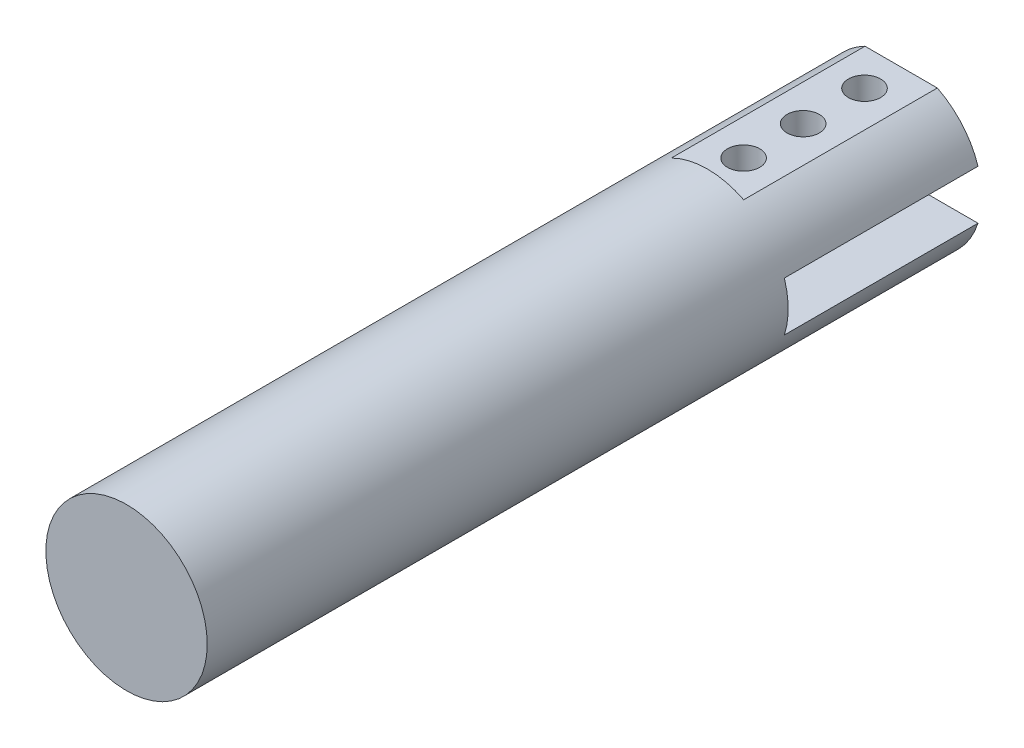
ISO-10303-21;
HEADER;
FILE_DESCRIPTION(('STEP AP214'),'2;1');
FILE_NAME('part.step','',(''),(''),'','','');
FILE_SCHEMA(('AUTOMOTIVE_DESIGN { 1 0 10303 214 1 1 1 1 }'));
ENDSEC;
DATA;
#1=APPLICATION_CONTEXT('core data for automotive mechanical design processes');
#2=APPLICATION_PROTOCOL_DEFINITION('international standard','automotive_design',2000,#1);
#3=PRODUCT_CONTEXT('',#1,'mechanical');
#4=PRODUCT('Part','Part','',(#3));
#5=PRODUCT_RELATED_PRODUCT_CATEGORY('part','',(#4));
#6=PRODUCT_DEFINITION_FORMATION('','',#4);
#7=PRODUCT_DEFINITION_CONTEXT('part definition',#1,'design');
#8=PRODUCT_DEFINITION('design','',#6,#7);
#9=PRODUCT_DEFINITION_SHAPE('','',#8);
#10=(LENGTH_UNIT() NAMED_UNIT(*) SI_UNIT(.MILLI.,.METRE.));
#11=(NAMED_UNIT(*) PLANE_ANGLE_UNIT() SI_UNIT($,.RADIAN.));
#12=(NAMED_UNIT(*) SI_UNIT($,.STERADIAN.) SOLID_ANGLE_UNIT());
#13=UNCERTAINTY_MEASURE_WITH_UNIT(LENGTH_MEASURE(1.E-05),#10,'distance_accuracy_value','');
#14=(GEOMETRIC_REPRESENTATION_CONTEXT(3) GLOBAL_UNCERTAINTY_ASSIGNED_CONTEXT((#13)) GLOBAL_UNIT_ASSIGNED_CONTEXT((#10,
#11,#12)) REPRESENTATION_CONTEXT('',''));
#15=CARTESIAN_POINT('',(0.,0.,0.));
#16=DIRECTION('',(0.,0.,1.));
#17=DIRECTION('',(1.,0.,0.));
#18=AXIS2_PLACEMENT_3D('',#15,#16,#17);
#19=CARTESIAN_POINT('',(0.,0.,0.));
#20=DIRECTION('',(0.,0.,1.));
#21=DIRECTION('',(1.,0.,0.));
#22=AXIS2_PLACEMENT_3D('',#19,#20,#21);
#23=PLANE('',#22);
#24=CARTESIAN_POINT('',(0.,0.,0.));
#25=DIRECTION('',(0.,0.,1.));
#26=DIRECTION('',(1.,0.,0.));
#27=AXIS2_PLACEMENT_3D('',#24,#25,#26);
#28=CIRCLE('',#27,12.5);
#29=CARTESIAN_POINT('',(5.60319328558987,-11.1738187297056,0.));
#30=VERTEX_POINT('',#29);
#31=CARTESIAN_POINT('',(11.901999831961,-3.82,0.));
#32=VERTEX_POINT('',#31);
#33=EDGE_CURVE('E111',#30,#32,#28,.T.);
#34=ORIENTED_EDGE('',*,*,#33,.F.);
#35=DIRECTION('',(1.,0.,0.));
#36=VECTOR('',#35,1.);
#37=CARTESIAN_POINT('',(16.1732901971352,-11.1738187297056,0.));
#38=LINE('',#37,#36);
#39=CARTESIAN_POINT('',(-5.60319328558987,-11.1738187297056,0.));
#40=VERTEX_POINT('',#39);
#41=EDGE_CURVE('E99',#40,#30,#38,.T.);
#42=ORIENTED_EDGE('',*,*,#41,.F.);
#43=CARTESIAN_POINT('',(-11.901999831961,-3.82,0.));
#44=VERTEX_POINT('',#43);
#45=EDGE_CURVE('E110',#44,#40,#28,.T.);
#46=ORIENTED_EDGE('',*,*,#45,.F.);
#47=DIRECTION('',(1.,0.,0.));
#48=VECTOR('',#47,1.);
#49=CARTESIAN_POINT('',(0.,-3.82,0.));
#50=LINE('',#49,#48);
#51=EDGE_CURVE('E131',#44,#32,#50,.T.);
#52=ORIENTED_EDGE('',*,*,#51,.T.);
#53=EDGE_LOOP('',(#34,#42,#46,#52));
#54=FACE_BOUND('',#53,.T.);
#55=ADVANCED_FACE('F31',(#54),#23,.F.);
#56=CARTESIAN_POINT('',(0.,0.,120.));
#57=DIRECTION('',(0.,0.,-1.));
#58=DIRECTION('',(-1.,0.,0.));
#59=AXIS2_PLACEMENT_3D('',#56,#57,#58);
#60=CYLINDRICAL_SURFACE('',#59,12.5);
#61=CARTESIAN_POINT('',(0.,0.,30.));
#62=DIRECTION('',(0.,0.,1.));
#63=DIRECTION('',(1.,0.,0.));
#64=AXIS2_PLACEMENT_3D('',#61,#62,#63);
#65=CIRCLE('',#64,12.5);
#66=CARTESIAN_POINT('',(-5.60319328558987,-11.1738187297056,30.));
#67=VERTEX_POINT('',#66);
#68=CARTESIAN_POINT('',(5.60319328558987,-11.1738187297056,30.));
#69=VERTEX_POINT('',#68);
#70=EDGE_CURVE('E11',#67,#69,#65,.T.);
#71=ORIENTED_EDGE('',*,*,#70,.T.);
#72=DIRECTION('',(0.,0.,-1.));
#73=VECTOR('',#72,1.);
#74=CARTESIAN_POINT('',(5.60319328558987,-11.1738187297056,120.));
#75=LINE('',#74,#73);
#76=EDGE_CURVE('E103',#69,#30,#75,.T.);
#77=ORIENTED_EDGE('',*,*,#76,.T.);
#78=ORIENTED_EDGE('',*,*,#33,.T.);
#79=DIRECTION('',(0.,0.,-1.));
#80=VECTOR('',#79,1.);
#81=CARTESIAN_POINT('',(11.901999831961,-3.82,120.));
#82=LINE('',#81,#80);
#83=CARTESIAN_POINT('',(11.901999831961,-3.82,30.));
#84=VERTEX_POINT('',#83);
#85=EDGE_CURVE('E134',#32,#84,#82,.F.);
#86=ORIENTED_EDGE('',*,*,#85,.T.);
#87=CARTESIAN_POINT('',(0.,0.,30.));
#88=DIRECTION('',(0.,0.,-1.));
#89=DIRECTION('',(-1.,0.,0.));
#90=AXIS2_PLACEMENT_3D('',#87,#88,#89);
#91=CIRCLE('',#90,12.5);
#92=CARTESIAN_POINT('',(11.901999831961,3.82,30.));
#93=VERTEX_POINT('',#92);
#94=EDGE_CURVE('E188',#93,#84,#91,.T.);
#95=ORIENTED_EDGE('',*,*,#94,.F.);
#96=DIRECTION('',(0.,0.,-1.));
#97=VECTOR('',#96,1.);
#98=CARTESIAN_POINT('',(11.901999831961,3.82,120.));
#99=LINE('',#98,#97);
#100=CARTESIAN_POINT('',(11.901999831961,3.82,0.));
#101=VERTEX_POINT('',#100);
#102=EDGE_CURVE('E137',#93,#101,#99,.T.);
#103=ORIENTED_EDGE('',*,*,#102,.T.);
#104=CARTESIAN_POINT('',(5.60319328558987,11.1738187297056,0.));
#105=VERTEX_POINT('',#104);
#106=EDGE_CURVE('E119',#101,#105,#28,.T.);
#107=ORIENTED_EDGE('',*,*,#106,.T.);
#108=DIRECTION('',(0.,0.,-1.));
#109=VECTOR('',#108,1.);
#110=CARTESIAN_POINT('',(5.60319328558987,11.1738187297056,120.));
#111=LINE('',#110,#109);
#112=CARTESIAN_POINT('',(5.60319328558987,11.1738187297056,30.));
#113=VERTEX_POINT('',#112);
#114=EDGE_CURVE('E53',#105,#113,#111,.F.);
#115=ORIENTED_EDGE('',*,*,#114,.T.);
#116=CARTESIAN_POINT('',(0.,0.,30.));
#117=DIRECTION('',(0.,0.,-1.));
#118=DIRECTION('',(-1.,0.,0.));
#119=AXIS2_PLACEMENT_3D('',#116,#117,#118);
#120=CIRCLE('',#119,12.5);
#121=CARTESIAN_POINT('',(-5.60319328558987,11.1738187297056,30.));
#122=VERTEX_POINT('',#121);
#123=EDGE_CURVE('E39',#122,#113,#120,.T.);
#124=ORIENTED_EDGE('',*,*,#123,.F.);
#125=DIRECTION('',(0.,0.,-1.));
#126=VECTOR('',#125,1.);
#127=CARTESIAN_POINT('',(-5.60319328558987,11.1738187297056,120.));
#128=LINE('',#127,#126);
#129=CARTESIAN_POINT('',(-5.60319328558987,11.1738187297056,0.));
#130=VERTEX_POINT('',#129);
#131=EDGE_CURVE('E160',#122,#130,#128,.T.);
#132=ORIENTED_EDGE('',*,*,#131,.T.);
#133=CARTESIAN_POINT('',(-11.901999831961,3.82,0.));
#134=VERTEX_POINT('',#133);
#135=EDGE_CURVE('E117',#130,#134,#28,.T.);
#136=ORIENTED_EDGE('',*,*,#135,.T.);
#137=DIRECTION('',(0.,0.,-1.));
#138=VECTOR('',#137,1.);
#139=CARTESIAN_POINT('',(-11.901999831961,3.82,120.));
#140=LINE('',#139,#138);
#141=CARTESIAN_POINT('',(-11.901999831961,3.82,30.));
#142=VERTEX_POINT('',#141);
#143=EDGE_CURVE('E139',#134,#142,#140,.F.);
#144=ORIENTED_EDGE('',*,*,#143,.T.);
#145=CARTESIAN_POINT('',(-11.901999831961,-3.82,30.));
#146=VERTEX_POINT('',#145);
#147=EDGE_CURVE('E197',#146,#142,#91,.T.);
#148=ORIENTED_EDGE('',*,*,#147,.F.);
#149=DIRECTION('',(0.,0.,-1.));
#150=VECTOR('',#149,1.);
#151=CARTESIAN_POINT('',(-11.901999831961,-3.82,120.));
#152=LINE('',#151,#150);
#153=EDGE_CURVE('E116',#146,#44,#152,.T.);
#154=ORIENTED_EDGE('',*,*,#153,.T.);
#155=ORIENTED_EDGE('',*,*,#45,.T.);
#156=DIRECTION('',(0.,0.,-1.));
#157=VECTOR('',#156,1.);
#158=CARTESIAN_POINT('',(-5.60319328558987,-11.1738187297056,120.));
#159=LINE('',#158,#157);
#160=EDGE_CURVE('E96',#40,#67,#159,.F.);
#161=ORIENTED_EDGE('',*,*,#160,.T.);
#162=EDGE_LOOP('',(#71,#77,#78,#86,#95,#103,#107,#115,#124,#132,#136,#144,#148,#154,#155,#161));
#163=FACE_BOUND('',#162,.T.);
#164=CARTESIAN_POINT('',(0.,0.,120.));
#165=DIRECTION('',(0.,0.,1.));
#166=DIRECTION('',(1.,0.,0.));
#167=AXIS2_PLACEMENT_3D('',#164,#165,#166);
#168=CIRCLE('',#167,12.5);
#169=CARTESIAN_POINT('',(12.5,0.,120.));
#170=VERTEX_POINT('',#169);
#171=EDGE_CURVE('E123',#170,#170,#168,.T.);
#172=ORIENTED_EDGE('',*,*,#171,.F.);
#173=EDGE_LOOP('',(#172));
#174=FACE_BOUND('',#173,.T.);
#175=ADVANCED_FACE('F33',(#163,#174),#60,.T.);
#176=CARTESIAN_POINT('',(0.,0.,120.));
#177=DIRECTION('',(0.,0.,1.));
#178=DIRECTION('',(1.,0.,0.));
#179=AXIS2_PLACEMENT_3D('',#176,#177,#178);
#180=PLANE('',#179);
#181=ORIENTED_EDGE('',*,*,#171,.T.);
#182=EDGE_LOOP('',(#181));
#183=FACE_BOUND('',#182,.T.);
#184=ADVANCED_FACE('F222',(#183),#180,.T.);
#185=ORIENTED_EDGE('',*,*,#135,.F.);
#186=DIRECTION('',(-1.,0.,0.));
#187=VECTOR('',#186,1.);
#188=CARTESIAN_POINT('',(16.1732901971352,11.1738187297056,0.));
#189=LINE('',#188,#187);
#190=EDGE_CURVE('E171',#105,#130,#189,.T.);
#191=ORIENTED_EDGE('',*,*,#190,.F.);
#192=ORIENTED_EDGE('',*,*,#106,.F.);
#193=DIRECTION('',(-1.,0.,0.));
#194=VECTOR('',#193,1.);
#195=CARTESIAN_POINT('',(0.,3.82,0.));
#196=LINE('',#195,#194);
#197=EDGE_CURVE('E127',#101,#134,#196,.T.);
#198=ORIENTED_EDGE('',*,*,#197,.T.);
#199=EDGE_LOOP('',(#185,#191,#192,#198));
#200=FACE_BOUND('',#199,.T.);
#201=ADVANCED_FACE('F218',(#200),#23,.F.);
#202=CARTESIAN_POINT('',(-35.1004559275796,-3.82,30.));
#203=DIRECTION('',(0.,0.,-1.));
#204=DIRECTION('',(-1.,0.,0.));
#205=AXIS2_PLACEMENT_3D('',#202,#203,#204);
#206=PLANE('',#205);
#207=ORIENTED_EDGE('',*,*,#94,.T.);
#208=DIRECTION('',(-1.,0.,0.));
#209=VECTOR('',#208,1.);
#210=CARTESIAN_POINT('',(35.1004559275796,-3.82,30.));
#211=LINE('',#210,#209);
#212=EDGE_CURVE('E142',#84,#146,#211,.T.);
#213=ORIENTED_EDGE('',*,*,#212,.T.);
#214=ORIENTED_EDGE('',*,*,#147,.T.);
#215=DIRECTION('',(1.,0.,0.));
#216=VECTOR('',#215,1.);
#217=CARTESIAN_POINT('',(35.1004559275796,3.82,30.));
#218=LINE('',#217,#216);
#219=EDGE_CURVE('E145',#142,#93,#218,.T.);
#220=ORIENTED_EDGE('',*,*,#219,.T.);
#221=EDGE_LOOP('',(#207,#213,#214,#220));
#222=FACE_BOUND('',#221,.T.);
#223=ADVANCED_FACE('F225',(#222),#206,.T.);
#224=CARTESIAN_POINT('',(35.1004559275796,-3.82,30.));
#225=DIRECTION('',(0.,-1.,0.));
#226=DIRECTION('',(0.,0.,-1.));
#227=AXIS2_PLACEMENT_3D('',#224,#225,#226);
#228=PLANE('',#227);
#229=CARTESIAN_POINT('',(0.,-3.82,24.408758255815));
#230=DIRECTION('',(0.,-1.,0.));
#231=DIRECTION('',(0.,0.,-1.));
#232=AXIS2_PLACEMENT_3D('',#229,#230,#231);
#233=CIRCLE('',#232,2.5);
#234=CARTESIAN_POINT('',(0.,-3.82,21.908758255815));
#235=VERTEX_POINT('',#234);
#236=EDGE_CURVE('E156',#235,#235,#233,.T.);
#237=ORIENTED_EDGE('',*,*,#236,.T.);
#238=EDGE_LOOP('',(#237));
#239=FACE_BOUND('',#238,.T.);
#240=CARTESIAN_POINT('',(0.,-3.82,15.185844733895));
#241=DIRECTION('',(0.,-1.,0.));
#242=DIRECTION('',(0.,0.,-1.));
#243=AXIS2_PLACEMENT_3D('',#240,#241,#242);
#244=CIRCLE('',#243,2.5);
#245=CARTESIAN_POINT('',(0.,-3.82,12.685844733895));
#246=VERTEX_POINT('',#245);
#247=EDGE_CURVE('E152',#246,#246,#244,.T.);
#248=ORIENTED_EDGE('',*,*,#247,.T.);
#249=EDGE_LOOP('',(#248));
#250=FACE_BOUND('',#249,.T.);
#251=CARTESIAN_POINT('',(0.,-3.82,5.68059709718584));
#252=DIRECTION('',(0.,-1.,0.));
#253=DIRECTION('',(0.,0.,-1.));
#254=AXIS2_PLACEMENT_3D('',#251,#252,#253);
#255=CIRCLE('',#254,2.5);
#256=CARTESIAN_POINT('',(0.,-3.82,3.18059709718584));
#257=VERTEX_POINT('',#256);
#258=EDGE_CURVE('E148',#257,#257,#255,.T.);
#259=ORIENTED_EDGE('',*,*,#258,.T.);
#260=EDGE_LOOP('',(#259));
#261=FACE_BOUND('',#260,.T.);
#262=ORIENTED_EDGE('',*,*,#212,.F.);
#263=ORIENTED_EDGE('',*,*,#85,.F.);
#264=ORIENTED_EDGE('',*,*,#51,.F.);
#265=ORIENTED_EDGE('',*,*,#153,.F.);
#266=EDGE_LOOP('',(#262,#263,#264,#265));
#267=FACE_BOUND('',#266,.T.);
#268=ADVANCED_FACE('F202',(#239,#250,#261,#267),#228,.F.);
#269=CARTESIAN_POINT('',(35.1004559275796,3.82,30.));
#270=DIRECTION('',(0.,1.,0.));
#271=DIRECTION('',(0.,0.,1.));
#272=AXIS2_PLACEMENT_3D('',#269,#270,#271);
#273=PLANE('',#272);
#274=CARTESIAN_POINT('',(0.,3.82,24.408758255815));
#275=DIRECTION('',(0.,1.,0.));
#276=DIRECTION('',(0.,0.,1.));
#277=AXIS2_PLACEMENT_3D('',#274,#275,#276);
#278=CIRCLE('',#277,2.5);
#279=CARTESIAN_POINT('',(0.,3.82,26.908758255815));
#280=VERTEX_POINT('',#279);
#281=EDGE_CURVE('E159',#280,#280,#278,.T.);
#282=ORIENTED_EDGE('',*,*,#281,.T.);
#283=EDGE_LOOP('',(#282));
#284=FACE_BOUND('',#283,.T.);
#285=CARTESIAN_POINT('',(0.,3.82,15.185844733895));
#286=DIRECTION('',(0.,1.,0.));
#287=DIRECTION('',(0.,0.,1.));
#288=AXIS2_PLACEMENT_3D('',#285,#286,#287);
#289=CIRCLE('',#288,2.5);
#290=CARTESIAN_POINT('',(0.,3.82,17.685844733895));
#291=VERTEX_POINT('',#290);
#292=EDGE_CURVE('E155',#291,#291,#289,.T.);
#293=ORIENTED_EDGE('',*,*,#292,.T.);
#294=EDGE_LOOP('',(#293));
#295=FACE_BOUND('',#294,.T.);
#296=CARTESIAN_POINT('',(0.,3.82,5.68059709718584));
#297=DIRECTION('',(0.,1.,0.));
#298=DIRECTION('',(0.,0.,1.));
#299=AXIS2_PLACEMENT_3D('',#296,#297,#298);
#300=CIRCLE('',#299,2.5);
#301=CARTESIAN_POINT('',(0.,3.82,8.18059709718585));
#302=VERTEX_POINT('',#301);
#303=EDGE_CURVE('E151',#302,#302,#300,.T.);
#304=ORIENTED_EDGE('',*,*,#303,.T.);
#305=EDGE_LOOP('',(#304));
#306=FACE_BOUND('',#305,.T.);
#307=ORIENTED_EDGE('',*,*,#219,.F.);
#308=ORIENTED_EDGE('',*,*,#143,.F.);
#309=ORIENTED_EDGE('',*,*,#197,.F.);
#310=ORIENTED_EDGE('',*,*,#102,.F.);
#311=EDGE_LOOP('',(#307,#308,#309,#310));
#312=FACE_BOUND('',#311,.T.);
#313=ADVANCED_FACE('F238',(#284,#295,#306,#312),#273,.F.);
#314=CARTESIAN_POINT('',(0.,-35.,5.68059709718584));
#315=DIRECTION('',(0.,1.,0.));
#316=DIRECTION('',(0.,0.,1.));
#317=AXIS2_PLACEMENT_3D('',#314,#315,#316);
#318=CYLINDRICAL_SURFACE('',#317,2.5);
#319=CARTESIAN_POINT('',(0.,11.1738187297056,5.68059709718584));
#320=DIRECTION('',(0.,-1.,0.));
#321=DIRECTION('',(0.,0.,-1.));
#322=AXIS2_PLACEMENT_3D('',#319,#320,#321);
#323=CIRCLE('',#322,2.5);
#324=CARTESIAN_POINT('',(0.,11.1738187297056,3.18059709718584));
#325=VERTEX_POINT('',#324);
#326=EDGE_CURVE('E164',#325,#325,#323,.F.);
#327=ORIENTED_EDGE('',*,*,#326,.T.);
#328=EDGE_LOOP('',(#327));
#329=FACE_BOUND('',#328,.T.);
#330=ORIENTED_EDGE('',*,*,#303,.F.);
#331=EDGE_LOOP('',(#330));
#332=FACE_BOUND('',#331,.T.);
#333=ADVANCED_FACE('F240',(#329,#332),#318,.F.);
#334=CARTESIAN_POINT('',(0.,-11.1738187297056,5.68059709718584));
#335=DIRECTION('',(0.,1.,0.));
#336=DIRECTION('',(0.,0.,1.));
#337=AXIS2_PLACEMENT_3D('',#334,#335,#336);
#338=CIRCLE('',#337,2.5);
#339=CARTESIAN_POINT('',(0.,-11.1738187297056,8.18059709718585));
#340=VERTEX_POINT('',#339);
#341=EDGE_CURVE('E104',#340,#340,#338,.F.);
#342=ORIENTED_EDGE('',*,*,#341,.T.);
#343=EDGE_LOOP('',(#342));
#344=FACE_BOUND('',#343,.T.);
#345=ORIENTED_EDGE('',*,*,#258,.F.);
#346=EDGE_LOOP('',(#345));
#347=FACE_BOUND('',#346,.T.);
#348=ADVANCED_FACE('F247',(#344,#347),#318,.F.);
#349=CARTESIAN_POINT('',(0.,-35.,15.185844733895));
#350=DIRECTION('',(0.,1.,0.));
#351=DIRECTION('',(0.,0.,1.));
#352=AXIS2_PLACEMENT_3D('',#349,#350,#351);
#353=CYLINDRICAL_SURFACE('',#352,2.5);
#354=CARTESIAN_POINT('',(0.,11.1738187297056,15.185844733895));
#355=DIRECTION('',(0.,-1.,0.));
#356=DIRECTION('',(0.,0.,-1.));
#357=AXIS2_PLACEMENT_3D('',#354,#355,#356);
#358=CIRCLE('',#357,2.5);
#359=CARTESIAN_POINT('',(0.,11.1738187297056,12.685844733895));
#360=VERTEX_POINT('',#359);
#361=EDGE_CURVE('E167',#360,#360,#358,.F.);
#362=ORIENTED_EDGE('',*,*,#361,.T.);
#363=EDGE_LOOP('',(#362));
#364=FACE_BOUND('',#363,.T.);
#365=ORIENTED_EDGE('',*,*,#292,.F.);
#366=EDGE_LOOP('',(#365));
#367=FACE_BOUND('',#366,.T.);
#368=ADVANCED_FACE('F255',(#364,#367),#353,.F.);
#369=CARTESIAN_POINT('',(0.,-11.1738187297056,15.185844733895));
#370=DIRECTION('',(0.,1.,0.));
#371=DIRECTION('',(0.,0.,1.));
#372=AXIS2_PLACEMENT_3D('',#369,#370,#371);
#373=CIRCLE('',#372,2.5);
#374=CARTESIAN_POINT('',(0.,-11.1738187297056,17.685844733895));
#375=VERTEX_POINT('',#374);
#376=EDGE_CURVE('E179',#375,#375,#373,.F.);
#377=ORIENTED_EDGE('',*,*,#376,.T.);
#378=EDGE_LOOP('',(#377));
#379=FACE_BOUND('',#378,.T.);
#380=ORIENTED_EDGE('',*,*,#247,.F.);
#381=EDGE_LOOP('',(#380));
#382=FACE_BOUND('',#381,.T.);
#383=ADVANCED_FACE('F257',(#379,#382),#353,.F.);
#384=CARTESIAN_POINT('',(0.,-35.,24.408758255815));
#385=DIRECTION('',(0.,1.,0.));
#386=DIRECTION('',(0.,0.,1.));
#387=AXIS2_PLACEMENT_3D('',#384,#385,#386);
#388=CYLINDRICAL_SURFACE('',#387,2.5);
#389=CARTESIAN_POINT('',(0.,11.1738187297056,24.408758255815));
#390=DIRECTION('',(0.,-1.,0.));
#391=DIRECTION('',(0.,0.,-1.));
#392=AXIS2_PLACEMENT_3D('',#389,#390,#391);
#393=CIRCLE('',#392,2.5);
#394=CARTESIAN_POINT('',(0.,11.1738187297056,21.908758255815));
#395=VERTEX_POINT('',#394);
#396=EDGE_CURVE('E170',#395,#395,#393,.F.);
#397=ORIENTED_EDGE('',*,*,#396,.T.);
#398=EDGE_LOOP('',(#397));
#399=FACE_BOUND('',#398,.T.);
#400=ORIENTED_EDGE('',*,*,#281,.F.);
#401=EDGE_LOOP('',(#400));
#402=FACE_BOUND('',#401,.T.);
#403=ADVANCED_FACE('F260',(#399,#402),#388,.F.);
#404=CARTESIAN_POINT('',(0.,-11.1738187297056,24.408758255815));
#405=DIRECTION('',(0.,1.,0.));
#406=DIRECTION('',(0.,0.,1.));
#407=AXIS2_PLACEMENT_3D('',#404,#405,#406);
#408=CIRCLE('',#407,2.5);
#409=CARTESIAN_POINT('',(0.,-11.1738187297056,26.908758255815));
#410=VERTEX_POINT('',#409);
#411=EDGE_CURVE('E181',#410,#410,#408,.F.);
#412=ORIENTED_EDGE('',*,*,#411,.T.);
#413=EDGE_LOOP('',(#412));
#414=FACE_BOUND('',#413,.T.);
#415=ORIENTED_EDGE('',*,*,#236,.F.);
#416=EDGE_LOOP('',(#415));
#417=FACE_BOUND('',#416,.T.);
#418=ADVANCED_FACE('F262',(#414,#417),#388,.F.);
#419=CARTESIAN_POINT('',(16.1732901971352,11.1738187297056,30.));
#420=DIRECTION('',(0.,0.,-1.));
#421=DIRECTION('',(-1.,0.,0.));
#422=AXIS2_PLACEMENT_3D('',#419,#420,#421);
#423=PLANE('',#422);
#424=ORIENTED_EDGE('',*,*,#123,.T.);
#425=DIRECTION('',(-1.,0.,0.));
#426=VECTOR('',#425,1.);
#427=CARTESIAN_POINT('',(16.1732901971352,11.1738187297056,30.));
#428=LINE('',#427,#426);
#429=EDGE_CURVE('E173',#113,#122,#428,.T.);
#430=ORIENTED_EDGE('',*,*,#429,.T.);
#431=EDGE_LOOP('',(#424,#430));
#432=FACE_BOUND('',#431,.T.);
#433=ADVANCED_FACE('F214',(#432),#423,.T.);
#434=CARTESIAN_POINT('',(16.1732901971352,11.1738187297056,30.));
#435=DIRECTION('',(0.,-1.,0.));
#436=DIRECTION('',(0.,0.,-1.));
#437=AXIS2_PLACEMENT_3D('',#434,#435,#436);
#438=PLANE('',#437);
#439=ORIENTED_EDGE('',*,*,#361,.F.);
#440=EDGE_LOOP('',(#439));
#441=FACE_BOUND('',#440,.T.);
#442=ORIENTED_EDGE('',*,*,#396,.F.);
#443=EDGE_LOOP('',(#442));
#444=FACE_BOUND('',#443,.T.);
#445=ORIENTED_EDGE('',*,*,#326,.F.);
#446=EDGE_LOOP('',(#445));
#447=FACE_BOUND('',#446,.T.);
#448=ORIENTED_EDGE('',*,*,#429,.F.);
#449=ORIENTED_EDGE('',*,*,#114,.F.);
#450=ORIENTED_EDGE('',*,*,#190,.T.);
#451=ORIENTED_EDGE('',*,*,#131,.F.);
#452=EDGE_LOOP('',(#448,#449,#450,#451));
#453=FACE_BOUND('',#452,.T.);
#454=ADVANCED_FACE('F206',(#441,#444,#447,#453),#438,.F.);
#455=CARTESIAN_POINT('',(16.1732901971352,-11.1738187297056,30.));
#456=DIRECTION('',(0.,0.,1.));
#457=DIRECTION('',(1.,0.,0.));
#458=AXIS2_PLACEMENT_3D('',#455,#456,#457);
#459=PLANE('',#458);
#460=DIRECTION('',(1.,0.,0.));
#461=VECTOR('',#460,1.);
#462=CARTESIAN_POINT('',(16.1732901971352,-11.1738187297056,30.));
#463=LINE('',#462,#461);
#464=EDGE_CURVE('E45',#67,#69,#463,.T.);
#465=ORIENTED_EDGE('',*,*,#464,.T.);
#466=ORIENTED_EDGE('',*,*,#70,.F.);
#467=EDGE_LOOP('',(#465,#466));
#468=FACE_BOUND('',#467,.T.);
#469=ADVANCED_FACE('F204',(#468),#459,.F.);
#470=CARTESIAN_POINT('',(16.1732901971352,-11.1738187297056,30.));
#471=DIRECTION('',(0.,1.,0.));
#472=DIRECTION('',(0.,0.,1.));
#473=AXIS2_PLACEMENT_3D('',#470,#471,#472);
#474=PLANE('',#473);
#475=ORIENTED_EDGE('',*,*,#376,.F.);
#476=EDGE_LOOP('',(#475));
#477=FACE_BOUND('',#476,.T.);
#478=ORIENTED_EDGE('',*,*,#411,.F.);
#479=EDGE_LOOP('',(#478));
#480=FACE_BOUND('',#479,.T.);
#481=ORIENTED_EDGE('',*,*,#341,.F.);
#482=EDGE_LOOP('',(#481));
#483=FACE_BOUND('',#482,.T.);
#484=ORIENTED_EDGE('',*,*,#464,.F.);
#485=ORIENTED_EDGE('',*,*,#160,.F.);
#486=ORIENTED_EDGE('',*,*,#41,.T.);
#487=ORIENTED_EDGE('',*,*,#76,.F.);
#488=EDGE_LOOP('',(#484,#485,#486,#487));
#489=FACE_BOUND('',#488,.T.);
#490=ADVANCED_FACE('F98',(#477,#480,#483,#489),#474,.F.);
#491=CLOSED_SHELL('',(#55,#175,#184,#201,#223,#268,#313,#333,#348,#368,#383,#403,#418,#433,#454,
#469,#490));
#492=MANIFOLD_SOLID_BREP('B2',#491);
#493=ADVANCED_BREP_SHAPE_REPRESENTATION('',(#18,#492),#14);
#494=SHAPE_DEFINITION_REPRESENTATION(#9,#493);
ENDSEC;
END-ISO-10303-21;
